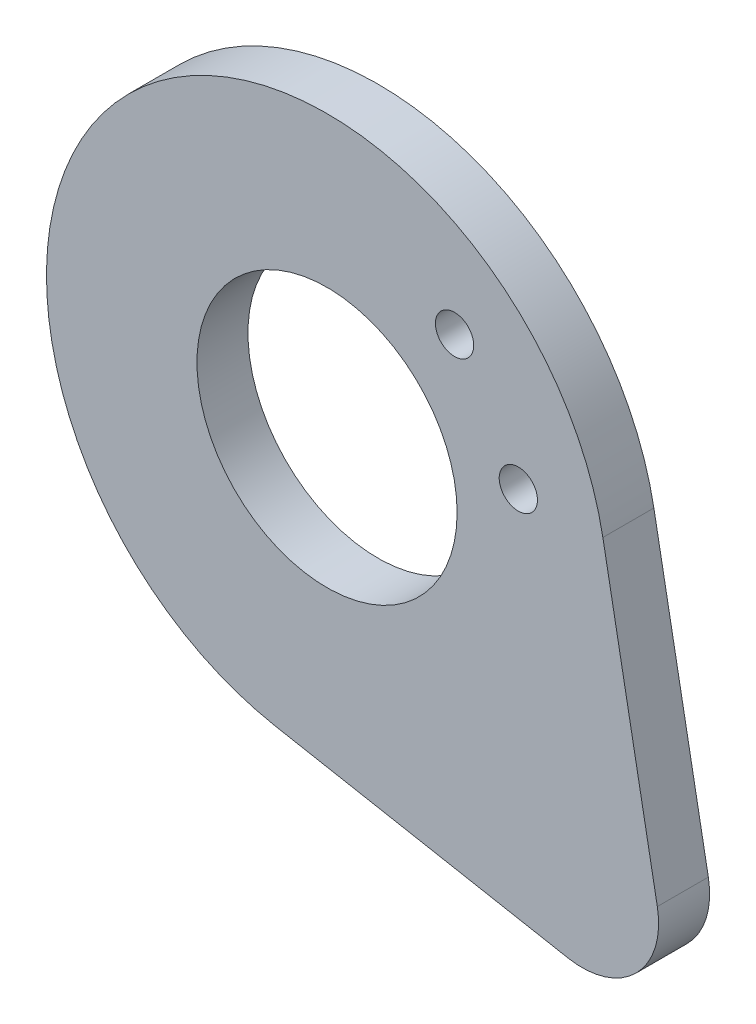
ISO-10303-21;
HEADER;
FILE_DESCRIPTION(('STEP AP214'),'2;1');
FILE_NAME('part.step','',(''),(''),'','','');
FILE_SCHEMA(('AUTOMOTIVE_DESIGN { 1 0 10303 214 1 1 1 1 }'));
ENDSEC;
DATA;
#1=APPLICATION_CONTEXT('core data for automotive mechanical design processes');
#2=APPLICATION_PROTOCOL_DEFINITION('international standard','automotive_design',2000,#1);
#3=PRODUCT_CONTEXT('',#1,'mechanical');
#4=PRODUCT('Part','Part','',(#3));
#5=PRODUCT_RELATED_PRODUCT_CATEGORY('part','',(#4));
#6=PRODUCT_DEFINITION_FORMATION('','',#4);
#7=PRODUCT_DEFINITION_CONTEXT('part definition',#1,'design');
#8=PRODUCT_DEFINITION('design','',#6,#7);
#9=PRODUCT_DEFINITION_SHAPE('','',#8);
#10=(LENGTH_UNIT() NAMED_UNIT(*) SI_UNIT(.MILLI.,.METRE.));
#11=(NAMED_UNIT(*) PLANE_ANGLE_UNIT() SI_UNIT($,.RADIAN.));
#12=(NAMED_UNIT(*) SI_UNIT($,.STERADIAN.) SOLID_ANGLE_UNIT());
#13=UNCERTAINTY_MEASURE_WITH_UNIT(LENGTH_MEASURE(1.E-05),#10,'distance_accuracy_value','');
#14=(GEOMETRIC_REPRESENTATION_CONTEXT(3) GLOBAL_UNCERTAINTY_ASSIGNED_CONTEXT((#13)) GLOBAL_UNIT_ASSIGNED_CONTEXT((#10,
#11,#12)) REPRESENTATION_CONTEXT('',''));
#15=CARTESIAN_POINT('',(0.,0.,0.));
#16=DIRECTION('',(0.,0.,1.));
#17=DIRECTION('',(1.,0.,0.));
#18=AXIS2_PLACEMENT_3D('',#15,#16,#17);
#19=CARTESIAN_POINT('',(-6.,-26.,54.4));
#20=DIRECTION('',(0.,0.,1.));
#21=DIRECTION('',(1.,0.,0.));
#22=AXIS2_PLACEMENT_3D('',#19,#20,#21);
#23=PLANE('',#22);
#24=CARTESIAN_POINT('',(-1.,-20.,54.4));
#25=DIRECTION('',(0.,0.,1.));
#26=DIRECTION('',(1.,0.,0.));
#27=AXIS2_PLACEMENT_3D('',#24,#25,#26);
#28=CIRCLE('',#27,0.75);
#29=CARTESIAN_POINT('',(-0.25,-20.,54.4));
#30=VERTEX_POINT('',#29);
#31=EDGE_CURVE('E115',#30,#30,#28,.T.);
#32=ORIENTED_EDGE('',*,*,#31,.F.);
#33=EDGE_LOOP('',(#32));
#34=FACE_BOUND('',#33,.T.);
#35=CARTESIAN_POINT('',(-6.,-26.,54.4));
#36=DIRECTION('',(0.,0.,1.));
#37=DIRECTION('',(1.,0.,0.));
#38=AXIS2_PLACEMENT_3D('',#35,#36,#37);
#39=CIRCLE('',#38,11.);
#40=CARTESIAN_POINT('',(4.81404708432983,-23.9859529156702,54.4));
#41=VERTEX_POINT('',#40);
#42=CARTESIAN_POINT('',(-8.01404708432983,-36.8140470843298,54.4));
#43=VERTEX_POINT('',#42);
#44=EDGE_CURVE('E85',#41,#43,#39,.T.);
#45=ORIENTED_EDGE('',*,*,#44,.T.);
#46=DIRECTION('',(0.98309518948453,-0.18309518948453,0.));
#47=VECTOR('',#46,1.);
#48=CARTESIAN_POINT('',(-8.01404708432983,-36.8140470843298,54.4));
#49=LINE('',#48,#47);
#50=CARTESIAN_POINT('',(3.45071443154641,-38.9492855684536,54.4));
#51=VERTEX_POINT('',#50);
#52=EDGE_CURVE('E80',#43,#51,#49,.T.);
#53=ORIENTED_EDGE('',*,*,#52,.T.);
#54=CARTESIAN_POINT('',(4.00000000000001,-36.,54.4));
#55=DIRECTION('',(0.,0.,1.));
#56=DIRECTION('',(1.,0.,0.));
#57=AXIS2_PLACEMENT_3D('',#54,#55,#56);
#58=CIRCLE('',#57,3.);
#59=CARTESIAN_POINT('',(6.94928556845359,-35.4507144315464,54.4));
#60=VERTEX_POINT('',#59);
#61=EDGE_CURVE('E83',#51,#60,#58,.T.);
#62=ORIENTED_EDGE('',*,*,#61,.T.);
#63=DIRECTION('',(-0.18309518948453,0.98309518948453,0.));
#64=VECTOR('',#63,1.);
#65=CARTESIAN_POINT('',(6.94928556845359,-35.4507144315464,54.4));
#66=LINE('',#65,#64);
#67=EDGE_CURVE('E50',#60,#41,#66,.T.);
#68=ORIENTED_EDGE('',*,*,#67,.T.);
#69=EDGE_LOOP('',(#45,#53,#62,#68));
#70=FACE_BOUND('',#69,.T.);
#71=CARTESIAN_POINT('',(-6.,-26.,54.4));
#72=DIRECTION('',(0.,0.,1.));
#73=DIRECTION('',(1.,0.,0.));
#74=AXIS2_PLACEMENT_3D('',#71,#72,#73);
#75=CIRCLE('',#74,5.1);
#76=CARTESIAN_POINT('',(-0.900000000000001,-26.,54.4));
#77=VERTEX_POINT('',#76);
#78=EDGE_CURVE('E100',#77,#77,#75,.T.);
#79=ORIENTED_EDGE('',*,*,#78,.F.);
#80=EDGE_LOOP('',(#79));
#81=FACE_BOUND('',#80,.T.);
#82=CARTESIAN_POINT('',(1.5,-24.,54.4));
#83=DIRECTION('',(0.,0.,1.));
#84=DIRECTION('',(1.,0.,0.));
#85=AXIS2_PLACEMENT_3D('',#82,#83,#84);
#86=CIRCLE('',#85,0.75);
#87=CARTESIAN_POINT('',(2.25,-24.,54.4));
#88=VERTEX_POINT('',#87);
#89=EDGE_CURVE('E121',#88,#88,#86,.T.);
#90=ORIENTED_EDGE('',*,*,#89,.F.);
#91=EDGE_LOOP('',(#90));
#92=FACE_BOUND('',#91,.T.);
#93=ADVANCED_FACE('F33',(#34,#70,#81,#92),#23,.T.);
#94=CARTESIAN_POINT('',(-6.,-26.,52.4));
#95=DIRECTION('',(0.,0.,1.));
#96=DIRECTION('',(1.,0.,0.));
#97=AXIS2_PLACEMENT_3D('',#94,#95,#96);
#98=PLANE('',#97);
#99=CARTESIAN_POINT('',(-6.,-26.,52.4));
#100=DIRECTION('',(0.,0.,1.));
#101=DIRECTION('',(1.,0.,0.));
#102=AXIS2_PLACEMENT_3D('',#99,#100,#101);
#103=CIRCLE('',#102,11.);
#104=CARTESIAN_POINT('',(4.81404708432983,-23.9859529156702,52.4));
#105=VERTEX_POINT('',#104);
#106=CARTESIAN_POINT('',(-8.01404708432983,-36.8140470843298,52.4));
#107=VERTEX_POINT('',#106);
#108=EDGE_CURVE('E97',#105,#107,#103,.T.);
#109=ORIENTED_EDGE('',*,*,#108,.F.);
#110=DIRECTION('',(-0.18309518948453,0.98309518948453,0.));
#111=VECTOR('',#110,1.);
#112=CARTESIAN_POINT('',(6.94928556845359,-35.4507144315464,52.4));
#113=LINE('',#112,#111);
#114=CARTESIAN_POINT('',(6.94928556845359,-35.4507144315464,52.4));
#115=VERTEX_POINT('',#114);
#116=EDGE_CURVE('E73',#115,#105,#113,.T.);
#117=ORIENTED_EDGE('',*,*,#116,.F.);
#118=CARTESIAN_POINT('',(4.00000000000001,-36.,52.4));
#119=DIRECTION('',(0.,0.,1.));
#120=DIRECTION('',(1.,0.,0.));
#121=AXIS2_PLACEMENT_3D('',#118,#119,#120);
#122=CIRCLE('',#121,3.);
#123=CARTESIAN_POINT('',(3.45071443154641,-38.9492855684536,52.4));
#124=VERTEX_POINT('',#123);
#125=EDGE_CURVE('E67',#124,#115,#122,.T.);
#126=ORIENTED_EDGE('',*,*,#125,.F.);
#127=DIRECTION('',(0.98309518948453,-0.18309518948453,0.));
#128=VECTOR('',#127,1.);
#129=CARTESIAN_POINT('',(-8.01404708432983,-36.8140470843298,52.4));
#130=LINE('',#129,#128);
#131=EDGE_CURVE('E89',#107,#124,#130,.T.);
#132=ORIENTED_EDGE('',*,*,#131,.F.);
#133=EDGE_LOOP('',(#109,#117,#126,#132));
#134=FACE_BOUND('',#133,.T.);
#135=CARTESIAN_POINT('',(-6.,-26.,52.4));
#136=DIRECTION('',(0.,0.,1.));
#137=DIRECTION('',(1.,0.,0.));
#138=AXIS2_PLACEMENT_3D('',#135,#136,#137);
#139=CIRCLE('',#138,5.1);
#140=CARTESIAN_POINT('',(-0.900000000000001,-26.,52.4));
#141=VERTEX_POINT('',#140);
#142=EDGE_CURVE('E112',#141,#141,#139,.T.);
#143=ORIENTED_EDGE('',*,*,#142,.T.);
#144=EDGE_LOOP('',(#143));
#145=FACE_BOUND('',#144,.T.);
#146=CARTESIAN_POINT('',(-1.,-20.,52.4));
#147=DIRECTION('',(0.,0.,1.));
#148=DIRECTION('',(1.,0.,0.));
#149=AXIS2_PLACEMENT_3D('',#146,#147,#148);
#150=CIRCLE('',#149,0.75);
#151=CARTESIAN_POINT('',(-0.25,-20.,52.4));
#152=VERTEX_POINT('',#151);
#153=EDGE_CURVE('E118',#152,#152,#150,.T.);
#154=ORIENTED_EDGE('',*,*,#153,.T.);
#155=EDGE_LOOP('',(#154));
#156=FACE_BOUND('',#155,.T.);
#157=CARTESIAN_POINT('',(1.5,-24.,52.4));
#158=DIRECTION('',(0.,0.,1.));
#159=DIRECTION('',(1.,0.,0.));
#160=AXIS2_PLACEMENT_3D('',#157,#158,#159);
#161=CIRCLE('',#160,0.75);
#162=CARTESIAN_POINT('',(2.25,-24.,52.4));
#163=VERTEX_POINT('',#162);
#164=EDGE_CURVE('E124',#163,#163,#161,.T.);
#165=ORIENTED_EDGE('',*,*,#164,.T.);
#166=EDGE_LOOP('',(#165));
#167=FACE_BOUND('',#166,.T.);
#168=ADVANCED_FACE('F108',(#134,#145,#156,#167),#98,.F.);
#169=CARTESIAN_POINT('',(-6.,-26.,54.4));
#170=DIRECTION('',(0.,0.,-1.));
#171=DIRECTION('',(-1.,0.,0.));
#172=AXIS2_PLACEMENT_3D('',#169,#170,#171);
#173=CYLINDRICAL_SURFACE('',#172,11.);
#174=ORIENTED_EDGE('',*,*,#108,.T.);
#175=DIRECTION('',(0.,0.,-1.));
#176=VECTOR('',#175,1.);
#177=CARTESIAN_POINT('',(-8.01404708432983,-36.8140470843298,54.4));
#178=LINE('',#177,#176);
#179=EDGE_CURVE('E11',#43,#107,#178,.T.);
#180=ORIENTED_EDGE('',*,*,#179,.F.);
#181=ORIENTED_EDGE('',*,*,#44,.F.);
#182=DIRECTION('',(0.,0.,-1.));
#183=VECTOR('',#182,1.);
#184=CARTESIAN_POINT('',(4.81404708432983,-23.9859529156702,54.4));
#185=LINE('',#184,#183);
#186=EDGE_CURVE('E93',#41,#105,#185,.T.);
#187=ORIENTED_EDGE('',*,*,#186,.T.);
#188=EDGE_LOOP('',(#174,#180,#181,#187));
#189=FACE_BOUND('',#188,.T.);
#190=ADVANCED_FACE('F35',(#189),#173,.T.);
#191=CARTESIAN_POINT('',(-8.01404708432983,-36.8140470843298,54.4));
#192=DIRECTION('',(0.18309518948453,0.98309518948453,0.));
#193=DIRECTION('',(-0.98309518948453,0.18309518948453,0.));
#194=AXIS2_PLACEMENT_3D('',#191,#192,#193);
#195=PLANE('',#194);
#196=ORIENTED_EDGE('',*,*,#131,.T.);
#197=DIRECTION('',(0.,0.,-1.));
#198=VECTOR('',#197,1.);
#199=CARTESIAN_POINT('',(3.45071443154641,-38.9492855684536,54.4));
#200=LINE('',#199,#198);
#201=EDGE_CURVE('E42',#51,#124,#200,.T.);
#202=ORIENTED_EDGE('',*,*,#201,.F.);
#203=ORIENTED_EDGE('',*,*,#52,.F.);
#204=ORIENTED_EDGE('',*,*,#179,.T.);
#205=EDGE_LOOP('',(#196,#202,#203,#204));
#206=FACE_BOUND('',#205,.T.);
#207=ADVANCED_FACE('F88',(#206),#195,.F.);
#208=CARTESIAN_POINT('',(4.00000000000001,-36.,54.4));
#209=DIRECTION('',(0.,0.,-1.));
#210=DIRECTION('',(-1.,0.,0.));
#211=AXIS2_PLACEMENT_3D('',#208,#209,#210);
#212=CYLINDRICAL_SURFACE('',#211,3.);
#213=ORIENTED_EDGE('',*,*,#125,.T.);
#214=DIRECTION('',(0.,0.,-1.));
#215=VECTOR('',#214,1.);
#216=CARTESIAN_POINT('',(6.94928556845359,-35.4507144315464,54.4));
#217=LINE('',#216,#215);
#218=EDGE_CURVE('E90',#60,#115,#217,.T.);
#219=ORIENTED_EDGE('',*,*,#218,.F.);
#220=ORIENTED_EDGE('',*,*,#61,.F.);
#221=ORIENTED_EDGE('',*,*,#201,.T.);
#222=EDGE_LOOP('',(#213,#219,#220,#221));
#223=FACE_BOUND('',#222,.T.);
#224=ADVANCED_FACE('F91',(#223),#212,.T.);
#225=CARTESIAN_POINT('',(6.94928556845359,-35.4507144315464,54.4));
#226=DIRECTION('',(-0.98309518948453,-0.18309518948453,0.));
#227=DIRECTION('',(0.18309518948453,-0.98309518948453,0.));
#228=AXIS2_PLACEMENT_3D('',#225,#226,#227);
#229=PLANE('',#228);
#230=ORIENTED_EDGE('',*,*,#116,.T.);
#231=ORIENTED_EDGE('',*,*,#186,.F.);
#232=ORIENTED_EDGE('',*,*,#67,.F.);
#233=ORIENTED_EDGE('',*,*,#218,.T.);
#234=EDGE_LOOP('',(#230,#231,#232,#233));
#235=FACE_BOUND('',#234,.T.);
#236=ADVANCED_FACE('F105',(#235),#229,.F.);
#237=CARTESIAN_POINT('',(-6.,-26.,54.4));
#238=DIRECTION('',(0.,0.,-1.));
#239=DIRECTION('',(-1.,0.,0.));
#240=AXIS2_PLACEMENT_3D('',#237,#238,#239);
#241=CYLINDRICAL_SURFACE('',#240,5.1);
#242=ORIENTED_EDGE('',*,*,#78,.T.);
#243=EDGE_LOOP('',(#242));
#244=FACE_BOUND('',#243,.T.);
#245=ORIENTED_EDGE('',*,*,#142,.F.);
#246=EDGE_LOOP('',(#245));
#247=FACE_BOUND('',#246,.T.);
#248=ADVANCED_FACE('F142',(#244,#247),#241,.F.);
#249=CARTESIAN_POINT('',(-1.,-20.,54.4));
#250=DIRECTION('',(0.,0.,-1.));
#251=DIRECTION('',(-1.,0.,0.));
#252=AXIS2_PLACEMENT_3D('',#249,#250,#251);
#253=CYLINDRICAL_SURFACE('',#252,0.75);
#254=ORIENTED_EDGE('',*,*,#31,.T.);
#255=EDGE_LOOP('',(#254));
#256=FACE_BOUND('',#255,.T.);
#257=ORIENTED_EDGE('',*,*,#153,.F.);
#258=EDGE_LOOP('',(#257));
#259=FACE_BOUND('',#258,.T.);
#260=ADVANCED_FACE('F188',(#256,#259),#253,.F.);
#261=CARTESIAN_POINT('',(1.5,-24.,54.4));
#262=DIRECTION('',(0.,0.,-1.));
#263=DIRECTION('',(-1.,0.,0.));
#264=AXIS2_PLACEMENT_3D('',#261,#262,#263);
#265=CYLINDRICAL_SURFACE('',#264,0.75);
#266=ORIENTED_EDGE('',*,*,#89,.T.);
#267=EDGE_LOOP('',(#266));
#268=FACE_BOUND('',#267,.T.);
#269=ORIENTED_EDGE('',*,*,#164,.F.);
#270=EDGE_LOOP('',(#269));
#271=FACE_BOUND('',#270,.T.);
#272=ADVANCED_FACE('F130',(#268,#271),#265,.F.);
#273=CLOSED_SHELL('',(#93,#168,#190,#207,#224,#236,#248,#260,#272));
#274=MANIFOLD_SOLID_BREP('B2',#273);
#275=ADVANCED_BREP_SHAPE_REPRESENTATION('',(#18,#274),#14);
#276=SHAPE_DEFINITION_REPRESENTATION(#9,#275);
ENDSEC;
END-ISO-10303-21;
